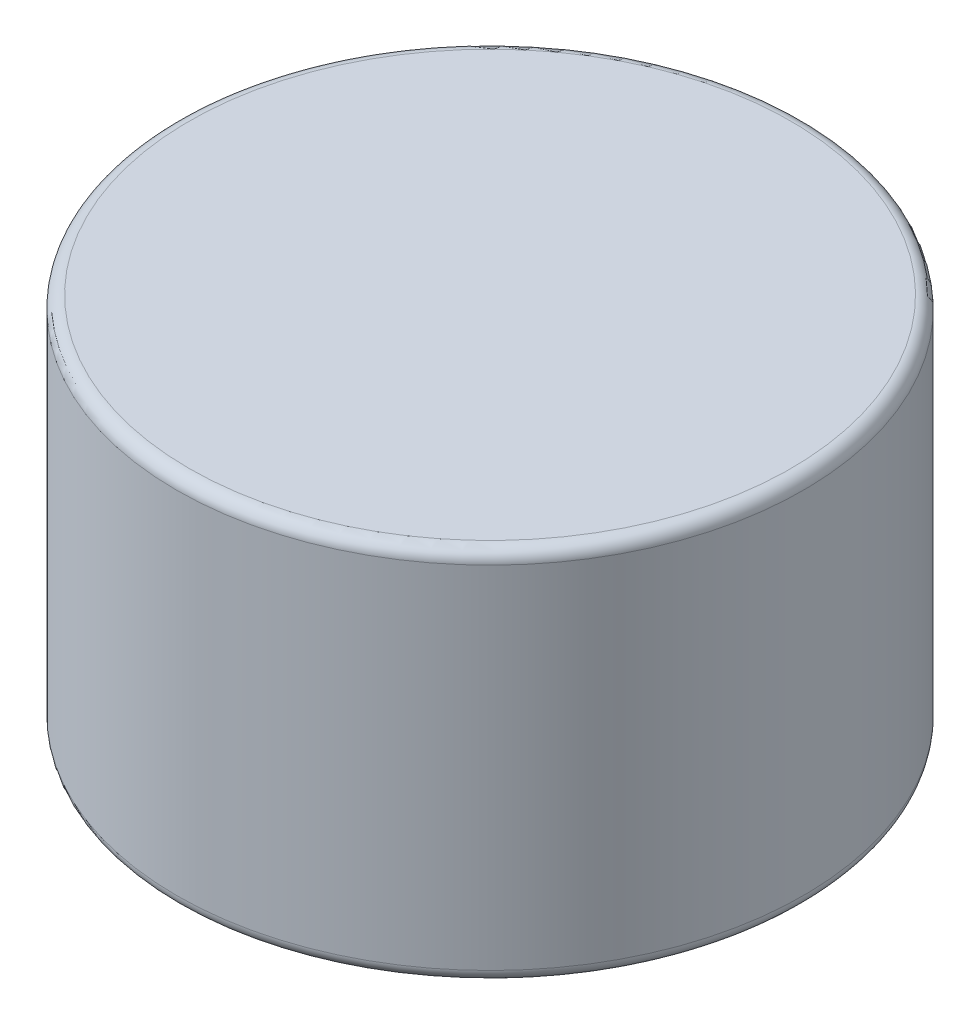
ISO-10303-21;
HEADER;
FILE_DESCRIPTION(('STEP AP214'),'2;1');
FILE_NAME('part.step','',(''),(''),'','','');
FILE_SCHEMA(('AUTOMOTIVE_DESIGN { 1 0 10303 214 1 1 1 1 }'));
ENDSEC;
DATA;
#1=APPLICATION_CONTEXT('core data for automotive mechanical design processes');
#2=APPLICATION_PROTOCOL_DEFINITION('international standard','automotive_design',2000,#1);
#3=PRODUCT_CONTEXT('',#1,'mechanical');
#4=PRODUCT('Part','Part','',(#3));
#5=PRODUCT_RELATED_PRODUCT_CATEGORY('part','',(#4));
#6=PRODUCT_DEFINITION_FORMATION('','',#4);
#7=PRODUCT_DEFINITION_CONTEXT('part definition',#1,'design');
#8=PRODUCT_DEFINITION('design','',#6,#7);
#9=PRODUCT_DEFINITION_SHAPE('','',#8);
#10=(LENGTH_UNIT() NAMED_UNIT(*) SI_UNIT(.MILLI.,.METRE.));
#11=(NAMED_UNIT(*) PLANE_ANGLE_UNIT() SI_UNIT($,.RADIAN.));
#12=(NAMED_UNIT(*) SI_UNIT($,.STERADIAN.) SOLID_ANGLE_UNIT());
#13=UNCERTAINTY_MEASURE_WITH_UNIT(LENGTH_MEASURE(1.E-05),#10,'distance_accuracy_value','');
#14=(GEOMETRIC_REPRESENTATION_CONTEXT(3) GLOBAL_UNCERTAINTY_ASSIGNED_CONTEXT((#13)) GLOBAL_UNIT_ASSIGNED_CONTEXT((#10,
#11,#12)) REPRESENTATION_CONTEXT('',''));
#15=CARTESIAN_POINT('',(0.,0.,0.));
#16=DIRECTION('',(0.,0.,1.));
#17=DIRECTION('',(1.,0.,0.));
#18=AXIS2_PLACEMENT_3D('',#15,#16,#17);
#19=CARTESIAN_POINT('',(0.,3.,0.));
#20=DIRECTION('',(0.,-1.,0.));
#21=DIRECTION('',(0.,0.,-1.));
#22=AXIS2_PLACEMENT_3D('',#19,#20,#21);
#23=CYLINDRICAL_SURFACE('',#22,2.5);
#24=CARTESIAN_POINT('',(0.,0.0999999999999998,0.));
#25=DIRECTION('',(0.,1.,0.));
#26=DIRECTION('',(0.,0.,1.));
#27=AXIS2_PLACEMENT_3D('',#24,#25,#26);
#28=CIRCLE('',#27,2.5);
#29=CARTESIAN_POINT('',(0.,0.0999999999999998,2.5));
#30=VERTEX_POINT('',#29);
#31=EDGE_CURVE('E54',#30,#30,#28,.T.);
#32=ORIENTED_EDGE('',*,*,#31,.T.);
#33=EDGE_LOOP('',(#32));
#34=FACE_BOUND('',#33,.T.);
#35=CARTESIAN_POINT('',(0.,2.9,0.));
#36=DIRECTION('',(0.,1.,0.));
#37=DIRECTION('',(0.,0.,1.));
#38=AXIS2_PLACEMENT_3D('',#35,#36,#37);
#39=CIRCLE('',#38,2.5);
#40=CARTESIAN_POINT('',(0.,2.9,2.5));
#41=VERTEX_POINT('',#40);
#42=EDGE_CURVE('E59',#41,#41,#39,.F.);
#43=ORIENTED_EDGE('',*,*,#42,.T.);
#44=EDGE_LOOP('',(#43));
#45=FACE_BOUND('',#44,.T.);
#46=ADVANCED_FACE('F41',(#34,#45),#23,.T.);
#47=CARTESIAN_POINT('',(0.,3.,0.));
#48=DIRECTION('',(0.,1.,0.));
#49=DIRECTION('',(0.,0.,1.));
#50=AXIS2_PLACEMENT_3D('',#47,#48,#49);
#51=PLANE('',#50);
#52=CARTESIAN_POINT('',(0.,3.,0.));
#53=DIRECTION('',(0.,1.,0.));
#54=DIRECTION('',(0.,0.,1.));
#55=AXIS2_PLACEMENT_3D('',#52,#53,#54);
#56=CIRCLE('',#55,2.4);
#57=CARTESIAN_POINT('',(0.,3.,2.4));
#58=VERTEX_POINT('',#57);
#59=EDGE_CURVE('E10',#58,#58,#56,.T.);
#60=ORIENTED_EDGE('',*,*,#59,.T.);
#61=EDGE_LOOP('',(#60));
#62=FACE_BOUND('',#61,.T.);
#63=ADVANCED_FACE('F76',(#62),#51,.T.);
#64=CARTESIAN_POINT('',(0.,0.,0.));
#65=DIRECTION('',(0.,1.,0.));
#66=DIRECTION('',(0.,0.,1.));
#67=AXIS2_PLACEMENT_3D('',#64,#65,#66);
#68=PLANE('',#67);
#69=CARTESIAN_POINT('',(0.,0.,0.));
#70=DIRECTION('',(0.,1.,0.));
#71=DIRECTION('',(0.,0.,1.));
#72=AXIS2_PLACEMENT_3D('',#69,#70,#71);
#73=CIRCLE('',#72,2.4);
#74=CARTESIAN_POINT('',(0.,0.,2.4));
#75=VERTEX_POINT('',#74);
#76=EDGE_CURVE('E49',#75,#75,#73,.F.);
#77=ORIENTED_EDGE('',*,*,#76,.T.);
#78=EDGE_LOOP('',(#77));
#79=FACE_BOUND('',#78,.T.);
#80=ADVANCED_FACE('F73',(#79),#68,.F.);
#81=CARTESIAN_POINT('',(0.,0.0999999999999998,0.));
#82=DIRECTION('',(0.,1.,0.));
#83=DIRECTION('',(0.,0.,1.));
#84=AXIS2_PLACEMENT_3D('',#81,#82,#83);
#85=TOROIDAL_SURFACE('',#84,2.4,0.1);
#86=ORIENTED_EDGE('',*,*,#76,.F.);
#87=EDGE_LOOP('',(#86));
#88=FACE_BOUND('',#87,.T.);
#89=ORIENTED_EDGE('',*,*,#31,.F.);
#90=EDGE_LOOP('',(#89));
#91=FACE_BOUND('',#90,.T.);
#92=ADVANCED_FACE('F69',(#88,#91),#85,.T.);
#93=CARTESIAN_POINT('',(0.,2.9,0.));
#94=DIRECTION('',(0.,1.,0.));
#95=DIRECTION('',(0.,0.,1.));
#96=AXIS2_PLACEMENT_3D('',#93,#94,#95);
#97=TOROIDAL_SURFACE('',#96,2.4,0.1);
#98=ORIENTED_EDGE('',*,*,#42,.F.);
#99=EDGE_LOOP('',(#98));
#100=FACE_BOUND('',#99,.T.);
#101=ORIENTED_EDGE('',*,*,#59,.F.);
#102=EDGE_LOOP('',(#101));
#103=FACE_BOUND('',#102,.T.);
#104=ADVANCED_FACE('F43',(#100,#103),#97,.T.);
#105=CLOSED_SHELL('',(#46,#63,#80,#92,#104));
#106=MANIFOLD_SOLID_BREP('B2',#105);
#107=ADVANCED_BREP_SHAPE_REPRESENTATION('',(#18,#106),#14);
#108=SHAPE_DEFINITION_REPRESENTATION(#9,#107);
ENDSEC;
END-ISO-10303-21;
